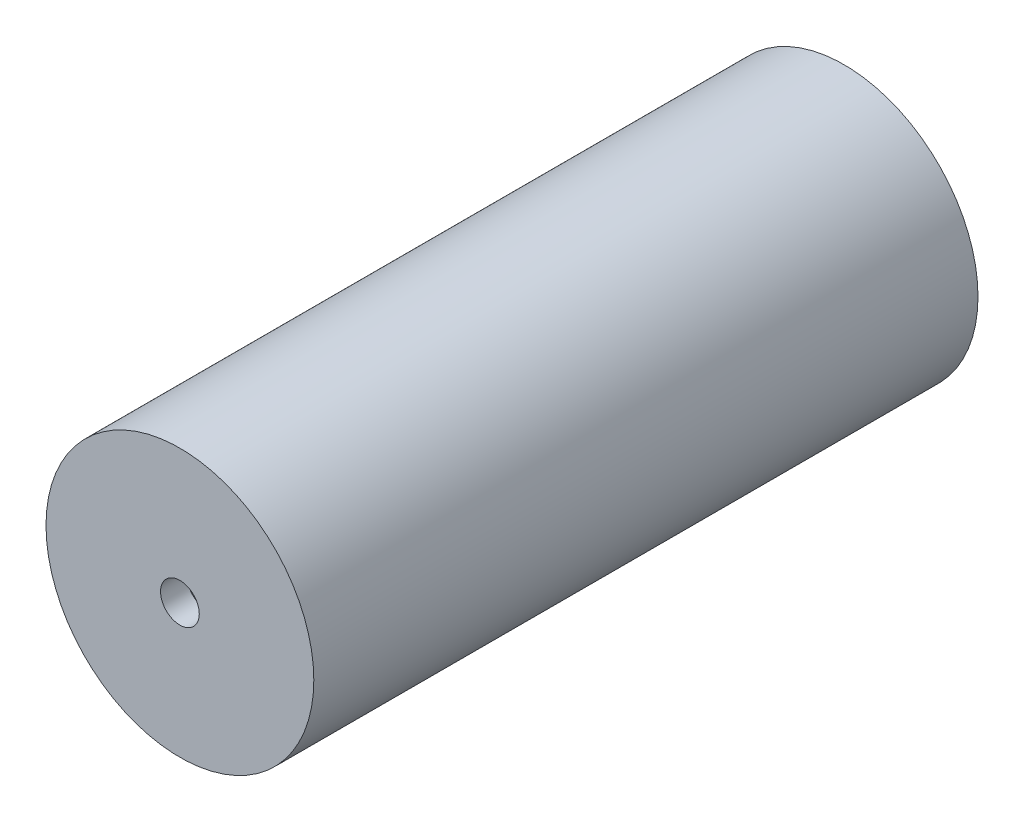
ISO-10303-21;
HEADER;
FILE_DESCRIPTION(('STEP AP214'),'2;1');
FILE_NAME('part.step','',(''),(''),'','','');
FILE_SCHEMA(('AUTOMOTIVE_DESIGN { 1 0 10303 214 1 1 1 1 }'));
ENDSEC;
DATA;
#1=APPLICATION_CONTEXT('core data for automotive mechanical design processes');
#2=APPLICATION_PROTOCOL_DEFINITION('international standard','automotive_design',2000,#1);
#3=PRODUCT_CONTEXT('',#1,'mechanical');
#4=PRODUCT('Part','Part','',(#3));
#5=PRODUCT_RELATED_PRODUCT_CATEGORY('part','',(#4));
#6=PRODUCT_DEFINITION_FORMATION('','',#4);
#7=PRODUCT_DEFINITION_CONTEXT('part definition',#1,'design');
#8=PRODUCT_DEFINITION('design','',#6,#7);
#9=PRODUCT_DEFINITION_SHAPE('','',#8);
#10=(LENGTH_UNIT() NAMED_UNIT(*) SI_UNIT(.MILLI.,.METRE.));
#11=(NAMED_UNIT(*) PLANE_ANGLE_UNIT() SI_UNIT($,.RADIAN.));
#12=(NAMED_UNIT(*) SI_UNIT($,.STERADIAN.) SOLID_ANGLE_UNIT());
#13=UNCERTAINTY_MEASURE_WITH_UNIT(LENGTH_MEASURE(1.E-05),#10,'distance_accuracy_value','');
#14=(GEOMETRIC_REPRESENTATION_CONTEXT(3) GLOBAL_UNCERTAINTY_ASSIGNED_CONTEXT((#13)) GLOBAL_UNIT_ASSIGNED_CONTEXT((#10,
#11,#12)) REPRESENTATION_CONTEXT('',''));
#15=CARTESIAN_POINT('',(0.,0.,0.));
#16=DIRECTION('',(0.,0.,1.));
#17=DIRECTION('',(1.,0.,0.));
#18=AXIS2_PLACEMENT_3D('',#15,#16,#17);
#19=CARTESIAN_POINT('',(0.,0.,50.));
#20=DIRECTION('',(0.,0.,1.));
#21=DIRECTION('',(1.,0.,0.));
#22=AXIS2_PLACEMENT_3D('',#19,#20,#21);
#23=PLANE('',#22);
#24=CARTESIAN_POINT('',(0.,0.,50.));
#25=DIRECTION('',(0.,0.,1.));
#26=DIRECTION('',(1.,0.,0.));
#27=AXIS2_PLACEMENT_3D('',#24,#25,#26);
#28=CIRCLE('',#27,36.45);
#29=CARTESIAN_POINT('',(36.45,0.,50.));
#30=VERTEX_POINT('',#29);
#31=EDGE_CURVE('E59',#30,#30,#28,.T.);
#32=ORIENTED_EDGE('',*,*,#31,.F.);
#33=EDGE_LOOP('',(#32));
#34=FACE_BOUND('',#33,.T.);
#35=CARTESIAN_POINT('',(0.,0.,50.));
#36=DIRECTION('',(0.,0.,1.));
#37=DIRECTION('',(1.,0.,0.));
#38=AXIS2_PLACEMENT_3D('',#35,#36,#37);
#39=CIRCLE('',#38,202.);
#40=CARTESIAN_POINT('',(202.,0.,50.));
#41=VERTEX_POINT('',#40);
#42=EDGE_CURVE('E10',#41,#41,#39,.F.);
#43=ORIENTED_EDGE('',*,*,#42,.F.);
#44=EDGE_LOOP('',(#43));
#45=FACE_BOUND('',#44,.T.);
#46=ADVANCED_FACE('F39',(#34,#45),#23,.T.);
#47=CARTESIAN_POINT('',(0.,0.,1199.92));
#48=DIRECTION('',(0.,0.,-1.));
#49=DIRECTION('',(-1.,0.,0.));
#50=AXIS2_PLACEMENT_3D('',#47,#48,#49);
#51=CYLINDRICAL_SURFACE('',#50,202.);
#52=CARTESIAN_POINT('',(0.,0.,1199.92));
#53=DIRECTION('',(0.,0.,1.));
#54=DIRECTION('',(1.,0.,0.));
#55=AXIS2_PLACEMENT_3D('',#52,#53,#54);
#56=CIRCLE('',#55,202.);
#57=CARTESIAN_POINT('',(202.,0.,1199.92));
#58=VERTEX_POINT('',#57);
#59=EDGE_CURVE('E51',#58,#58,#56,.T.);
#60=ORIENTED_EDGE('',*,*,#59,.T.);
#61=EDGE_LOOP('',(#60));
#62=FACE_BOUND('',#61,.T.);
#63=ORIENTED_EDGE('',*,*,#42,.T.);
#64=EDGE_LOOP('',(#63));
#65=FACE_BOUND('',#64,.T.);
#66=ADVANCED_FACE('F85',(#62,#65),#51,.F.);
#67=CARTESIAN_POINT('',(0.,0.,1199.92));
#68=DIRECTION('',(0.,0.,1.));
#69=DIRECTION('',(1.,0.,0.));
#70=AXIS2_PLACEMENT_3D('',#67,#68,#69);
#71=PLANE('',#70);
#72=CARTESIAN_POINT('',(0.,0.,1199.92));
#73=DIRECTION('',(0.,0.,1.));
#74=DIRECTION('',(1.,0.,0.));
#75=AXIS2_PLACEMENT_3D('',#72,#73,#74);
#76=CIRCLE('',#75,36.45);
#77=CARTESIAN_POINT('',(36.45,0.,1199.92));
#78=VERTEX_POINT('',#77);
#79=EDGE_CURVE('E43',#78,#78,#76,.T.);
#80=ORIENTED_EDGE('',*,*,#79,.T.);
#81=EDGE_LOOP('',(#80));
#82=FACE_BOUND('',#81,.T.);
#83=ORIENTED_EDGE('',*,*,#59,.F.);
#84=EDGE_LOOP('',(#83));
#85=FACE_BOUND('',#84,.T.);
#86=ADVANCED_FACE('F72',(#82,#85),#71,.F.);
#87=CARTESIAN_POINT('',(0.,0.,0.));
#88=DIRECTION('',(0.,0.,1.));
#89=DIRECTION('',(1.,0.,0.));
#90=AXIS2_PLACEMENT_3D('',#87,#88,#89);
#91=CYLINDRICAL_SURFACE('',#90,36.45);
#92=CARTESIAN_POINT('',(0.,0.,1249.92));
#93=DIRECTION('',(0.,0.,1.));
#94=DIRECTION('',(1.,0.,0.));
#95=AXIS2_PLACEMENT_3D('',#92,#93,#94);
#96=CIRCLE('',#95,36.45);
#97=CARTESIAN_POINT('',(36.45,0.,1249.92));
#98=VERTEX_POINT('',#97);
#99=EDGE_CURVE('E62',#98,#98,#96,.T.);
#100=ORIENTED_EDGE('',*,*,#99,.T.);
#101=EDGE_LOOP('',(#100));
#102=FACE_BOUND('',#101,.T.);
#103=ORIENTED_EDGE('',*,*,#79,.F.);
#104=EDGE_LOOP('',(#103));
#105=FACE_BOUND('',#104,.T.);
#106=ADVANCED_FACE('F75',(#102,#105),#91,.F.);
#107=ORIENTED_EDGE('',*,*,#31,.T.);
#108=EDGE_LOOP('',(#107));
#109=FACE_BOUND('',#108,.T.);
#110=CARTESIAN_POINT('',(0.,0.,0.));
#111=DIRECTION('',(0.,0.,1.));
#112=DIRECTION('',(1.,0.,0.));
#113=AXIS2_PLACEMENT_3D('',#110,#111,#112);
#114=CIRCLE('',#113,36.45);
#115=CARTESIAN_POINT('',(36.45,0.,0.));
#116=VERTEX_POINT('',#115);
#117=EDGE_CURVE('E65',#116,#116,#114,.T.);
#118=ORIENTED_EDGE('',*,*,#117,.F.);
#119=EDGE_LOOP('',(#118));
#120=FACE_BOUND('',#119,.T.);
#121=ADVANCED_FACE('F77',(#109,#120),#91,.F.);
#122=CARTESIAN_POINT('',(0.,0.,50.));
#123=DIRECTION('',(0.,0.,-1.));
#124=DIRECTION('',(-1.,0.,0.));
#125=AXIS2_PLACEMENT_3D('',#122,#123,#124);
#126=CYLINDRICAL_SURFACE('',#125,252.);
#127=CARTESIAN_POINT('',(0.,0.,0.));
#128=DIRECTION('',(0.,0.,1.));
#129=DIRECTION('',(1.,0.,0.));
#130=AXIS2_PLACEMENT_3D('',#127,#128,#129);
#131=CIRCLE('',#130,252.);
#132=CARTESIAN_POINT('',(252.,0.,0.));
#133=VERTEX_POINT('',#132);
#134=EDGE_CURVE('E47',#133,#133,#131,.T.);
#135=ORIENTED_EDGE('',*,*,#134,.T.);
#136=EDGE_LOOP('',(#135));
#137=FACE_BOUND('',#136,.T.);
#138=CARTESIAN_POINT('',(0.,0.,1249.92));
#139=DIRECTION('',(0.,0.,1.));
#140=DIRECTION('',(1.,0.,0.));
#141=AXIS2_PLACEMENT_3D('',#138,#139,#140);
#142=CIRCLE('',#141,252.);
#143=CARTESIAN_POINT('',(252.,0.,1249.92));
#144=VERTEX_POINT('',#143);
#145=EDGE_CURVE('E56',#144,#144,#142,.T.);
#146=ORIENTED_EDGE('',*,*,#145,.F.);
#147=EDGE_LOOP('',(#146));
#148=FACE_BOUND('',#147,.T.);
#149=ADVANCED_FACE('F41',(#137,#148),#126,.T.);
#150=CARTESIAN_POINT('',(0.,0.,0.));
#151=DIRECTION('',(0.,0.,1.));
#152=DIRECTION('',(1.,0.,0.));
#153=AXIS2_PLACEMENT_3D('',#150,#151,#152);
#154=PLANE('',#153);
#155=ORIENTED_EDGE('',*,*,#117,.T.);
#156=EDGE_LOOP('',(#155));
#157=FACE_BOUND('',#156,.T.);
#158=ORIENTED_EDGE('',*,*,#134,.F.);
#159=EDGE_LOOP('',(#158));
#160=FACE_BOUND('',#159,.T.);
#161=ADVANCED_FACE('F98',(#157,#160),#154,.F.);
#162=CARTESIAN_POINT('',(0.,0.,1249.92));
#163=DIRECTION('',(0.,0.,1.));
#164=DIRECTION('',(1.,0.,0.));
#165=AXIS2_PLACEMENT_3D('',#162,#163,#164);
#166=PLANE('',#165);
#167=ORIENTED_EDGE('',*,*,#99,.F.);
#168=EDGE_LOOP('',(#167));
#169=FACE_BOUND('',#168,.T.);
#170=ORIENTED_EDGE('',*,*,#145,.T.);
#171=EDGE_LOOP('',(#170));
#172=FACE_BOUND('',#171,.T.);
#173=ADVANCED_FACE('F100',(#169,#172),#166,.T.);
#174=CLOSED_SHELL('',(#46,#66,#86,#106,#121,#149,#161,#173));
#175=MANIFOLD_SOLID_BREP('B2',#174);
#176=ADVANCED_BREP_SHAPE_REPRESENTATION('',(#18,#175),#14);
#177=SHAPE_DEFINITION_REPRESENTATION(#9,#176);
ENDSEC;
END-ISO-10303-21;
